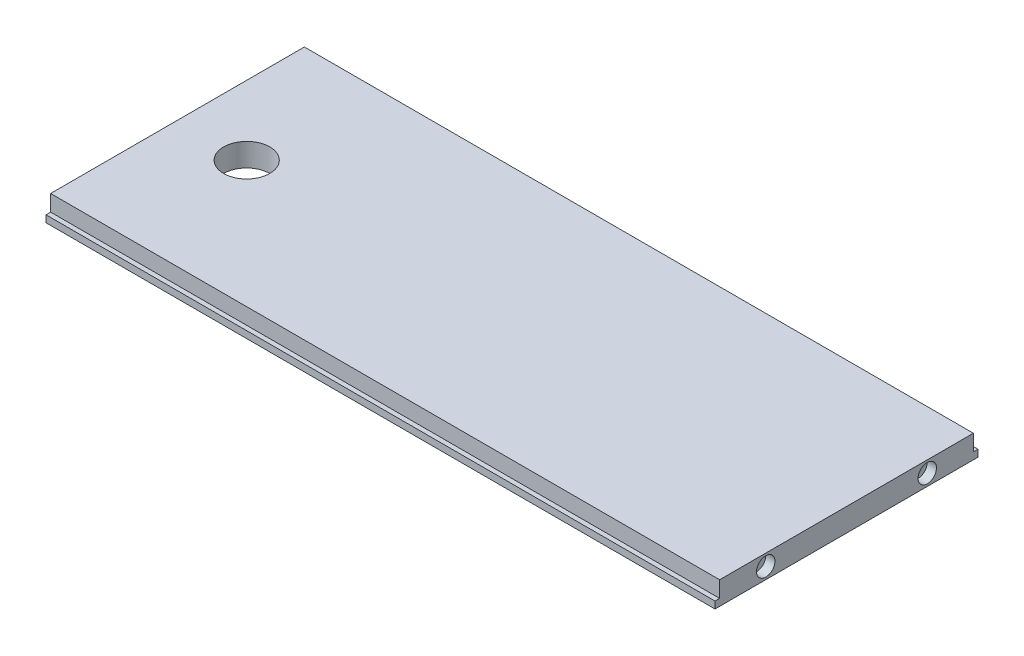
ISO-10303-21;
HEADER;
FILE_DESCRIPTION(('STEP AP214'),'2;1');
FILE_NAME('part.step','',(''),(''),'','','');
FILE_SCHEMA(('AUTOMOTIVE_DESIGN { 1 0 10303 214 1 1 1 1 }'));
ENDSEC;
DATA;
#1=APPLICATION_CONTEXT('core data for automotive mechanical design processes');
#2=APPLICATION_PROTOCOL_DEFINITION('international standard','automotive_design',2000,#1);
#3=PRODUCT_CONTEXT('',#1,'mechanical');
#4=PRODUCT('Part','Part','',(#3));
#5=PRODUCT_RELATED_PRODUCT_CATEGORY('part','',(#4));
#6=PRODUCT_DEFINITION_FORMATION('','',#4);
#7=PRODUCT_DEFINITION_CONTEXT('part definition',#1,'design');
#8=PRODUCT_DEFINITION('design','',#6,#7);
#9=PRODUCT_DEFINITION_SHAPE('','',#8);
#10=(LENGTH_UNIT() NAMED_UNIT(*) SI_UNIT(.MILLI.,.METRE.));
#11=(NAMED_UNIT(*) PLANE_ANGLE_UNIT() SI_UNIT($,.RADIAN.));
#12=(NAMED_UNIT(*) SI_UNIT($,.STERADIAN.) SOLID_ANGLE_UNIT());
#13=UNCERTAINTY_MEASURE_WITH_UNIT(LENGTH_MEASURE(1.E-05),#10,'distance_accuracy_value','');
#14=(GEOMETRIC_REPRESENTATION_CONTEXT(3) GLOBAL_UNCERTAINTY_ASSIGNED_CONTEXT((#13)) GLOBAL_UNIT_ASSIGNED_CONTEXT((#10,
#11,#12)) REPRESENTATION_CONTEXT('',''));
#15=CARTESIAN_POINT('',(0.,0.,0.));
#16=DIRECTION('',(0.,0.,1.));
#17=DIRECTION('',(1.,0.,0.));
#18=AXIS2_PLACEMENT_3D('',#15,#16,#17);
#19=CARTESIAN_POINT('',(0.,10.,-114.));
#20=DIRECTION('',(0.,0.,1.));
#21=DIRECTION('',(1.,0.,0.));
#22=AXIS2_PLACEMENT_3D('',#19,#20,#21);
#23=PLANE('',#22);
#24=DIRECTION('',(-1.,0.,0.));
#25=VECTOR('',#24,1.);
#26=CARTESIAN_POINT('',(0.,3.,-114.));
#27=LINE('',#26,#25);
#28=CARTESIAN_POINT('',(290.,3.,-114.));
#29=VERTEX_POINT('',#28);
#30=CARTESIAN_POINT('',(0.,3.,-114.));
#31=VERTEX_POINT('',#30);
#32=EDGE_CURVE('E109',#29,#31,#27,.T.);
#33=ORIENTED_EDGE('',*,*,#32,.F.);
#34=DIRECTION('',(0.,-1.,0.));
#35=VECTOR('',#34,1.);
#36=CARTESIAN_POINT('',(290.,10.,-114.));
#37=LINE('',#36,#35);
#38=CARTESIAN_POINT('',(290.,0.,-114.));
#39=VERTEX_POINT('',#38);
#40=EDGE_CURVE('E156',#29,#39,#37,.T.);
#41=ORIENTED_EDGE('',*,*,#40,.T.);
#42=DIRECTION('',(-1.,0.,0.));
#43=VECTOR('',#42,1.);
#44=CARTESIAN_POINT('',(0.,0.,-114.));
#45=LINE('',#44,#43);
#46=CARTESIAN_POINT('',(0.,0.,-114.));
#47=VERTEX_POINT('',#46);
#48=EDGE_CURVE('E141',#39,#47,#45,.T.);
#49=ORIENTED_EDGE('',*,*,#48,.T.);
#50=DIRECTION('',(0.,-1.,0.));
#51=VECTOR('',#50,1.);
#52=CARTESIAN_POINT('',(0.,10.,-114.));
#53=LINE('',#52,#51);
#54=EDGE_CURVE('E144',#31,#47,#53,.T.);
#55=ORIENTED_EDGE('',*,*,#54,.F.);
#56=EDGE_LOOP('',(#33,#41,#49,#55));
#57=FACE_BOUND('',#56,.T.);
#58=ADVANCED_FACE('F33',(#57),#23,.F.);
#59=CARTESIAN_POINT('',(0.,10.,0.));
#60=DIRECTION('',(1.,0.,0.));
#61=DIRECTION('',(0.,0.,-1.));
#62=AXIS2_PLACEMENT_3D('',#59,#60,#61);
#63=PLANE('',#62);
#64=DIRECTION('',(0.,0.,1.));
#65=VECTOR('',#64,1.);
#66=CARTESIAN_POINT('',(0.,10.,0.));
#67=LINE('',#66,#65);
#68=CARTESIAN_POINT('',(0.,10.,-112.));
#69=VERTEX_POINT('',#68);
#70=CARTESIAN_POINT('',(0.,10.,-2.));
#71=VERTEX_POINT('',#70);
#72=EDGE_CURVE('E117',#69,#71,#67,.T.);
#73=ORIENTED_EDGE('',*,*,#72,.F.);
#74=DIRECTION('',(0.,1.,0.));
#75=VECTOR('',#74,1.);
#76=CARTESIAN_POINT('',(0.,3.,-112.));
#77=LINE('',#76,#75);
#78=CARTESIAN_POINT('',(0.,3.,-112.));
#79=VERTEX_POINT('',#78);
#80=EDGE_CURVE('E56',#79,#69,#77,.T.);
#81=ORIENTED_EDGE('',*,*,#80,.F.);
#82=DIRECTION('',(0.,0.,1.));
#83=VECTOR('',#82,1.);
#84=CARTESIAN_POINT('',(0.,3.,-114.));
#85=LINE('',#84,#83);
#86=EDGE_CURVE('E104',#31,#79,#85,.T.);
#87=ORIENTED_EDGE('',*,*,#86,.F.);
#88=ORIENTED_EDGE('',*,*,#54,.T.);
#89=DIRECTION('',(0.,0.,1.));
#90=VECTOR('',#89,1.);
#91=CARTESIAN_POINT('',(0.,0.,0.));
#92=LINE('',#91,#90);
#93=CARTESIAN_POINT('',(0.,0.,0.));
#94=VERTEX_POINT('',#93);
#95=EDGE_CURVE('E119',#47,#94,#92,.T.);
#96=ORIENTED_EDGE('',*,*,#95,.T.);
#97=DIRECTION('',(0.,-1.,0.));
#98=VECTOR('',#97,1.);
#99=CARTESIAN_POINT('',(0.,10.,0.));
#100=LINE('',#99,#98);
#101=CARTESIAN_POINT('',(0.,3.,0.));
#102=VERTEX_POINT('',#101);
#103=EDGE_CURVE('E11',#102,#94,#100,.T.);
#104=ORIENTED_EDGE('',*,*,#103,.F.);
#105=DIRECTION('',(0.,0.,1.));
#106=VECTOR('',#105,1.);
#107=CARTESIAN_POINT('',(0.,3.,0.));
#108=LINE('',#107,#106);
#109=CARTESIAN_POINT('',(0.,3.,-2.));
#110=VERTEX_POINT('',#109);
#111=EDGE_CURVE('E124',#110,#102,#108,.T.);
#112=ORIENTED_EDGE('',*,*,#111,.F.);
#113=DIRECTION('',(0.,1.,0.));
#114=VECTOR('',#113,1.);
#115=CARTESIAN_POINT('',(0.,3.,-2.));
#116=LINE('',#115,#114);
#117=EDGE_CURVE('E136',#110,#71,#116,.T.);
#118=ORIENTED_EDGE('',*,*,#117,.T.);
#119=EDGE_LOOP('',(#73,#81,#87,#88,#96,#104,#112,#118));
#120=FACE_BOUND('',#119,.T.);
#121=ADVANCED_FACE('F35',(#120),#63,.F.);
#122=CARTESIAN_POINT('',(0.,10.,0.));
#123=DIRECTION('',(0.,0.,-1.));
#124=DIRECTION('',(-1.,0.,0.));
#125=AXIS2_PLACEMENT_3D('',#122,#123,#124);
#126=PLANE('',#125);
#127=DIRECTION('',(0.,-1.,0.));
#128=VECTOR('',#127,1.);
#129=CARTESIAN_POINT('',(290.,10.,0.));
#130=LINE('',#129,#128);
#131=CARTESIAN_POINT('',(290.,3.,0.));
#132=VERTEX_POINT('',#131);
#133=CARTESIAN_POINT('',(290.,0.,0.));
#134=VERTEX_POINT('',#133);
#135=EDGE_CURVE('E41',#132,#134,#130,.T.);
#136=ORIENTED_EDGE('',*,*,#135,.F.);
#137=DIRECTION('',(1.,0.,0.));
#138=VECTOR('',#137,1.);
#139=CARTESIAN_POINT('',(0.,3.,0.));
#140=LINE('',#139,#138);
#141=EDGE_CURVE('E126',#102,#132,#140,.T.);
#142=ORIENTED_EDGE('',*,*,#141,.F.);
#143=ORIENTED_EDGE('',*,*,#103,.T.);
#144=DIRECTION('',(1.,0.,0.));
#145=VECTOR('',#144,1.);
#146=CARTESIAN_POINT('',(0.,0.,0.));
#147=LINE('',#146,#145);
#148=EDGE_CURVE('E147',#94,#134,#147,.T.);
#149=ORIENTED_EDGE('',*,*,#148,.T.);
#150=EDGE_LOOP('',(#136,#142,#143,#149));
#151=FACE_BOUND('',#150,.T.);
#152=ADVANCED_FACE('F167',(#151),#126,.F.);
#153=CARTESIAN_POINT('',(290.,10.,0.));
#154=DIRECTION('',(-1.,0.,0.));
#155=DIRECTION('',(0.,0.,1.));
#156=AXIS2_PLACEMENT_3D('',#153,#154,#155);
#157=PLANE('',#156);
#158=CARTESIAN_POINT('',(290.,5.,-22.));
#159=DIRECTION('',(1.,0.,0.));
#160=DIRECTION('',(0.,0.,-1.));
#161=AXIS2_PLACEMENT_3D('',#158,#159,#160);
#162=CIRCLE('',#161,4.);
#163=CARTESIAN_POINT('',(290.,5.,-26.));
#164=VERTEX_POINT('',#163);
#165=EDGE_CURVE('E310',#164,#164,#162,.T.);
#166=ORIENTED_EDGE('',*,*,#165,.F.);
#167=EDGE_LOOP('',(#166));
#168=FACE_BOUND('',#167,.T.);
#169=CARTESIAN_POINT('',(290.,5.,-92.));
#170=DIRECTION('',(1.,0.,0.));
#171=DIRECTION('',(0.,0.,-1.));
#172=AXIS2_PLACEMENT_3D('',#169,#170,#171);
#173=CIRCLE('',#172,4.00000000000001);
#174=CARTESIAN_POINT('',(290.,5.,-96.));
#175=VERTEX_POINT('',#174);
#176=EDGE_CURVE('E305',#175,#175,#173,.T.);
#177=ORIENTED_EDGE('',*,*,#176,.F.);
#178=EDGE_LOOP('',(#177));
#179=FACE_BOUND('',#178,.T.);
#180=DIRECTION('',(0.,0.,-1.));
#181=VECTOR('',#180,1.);
#182=CARTESIAN_POINT('',(290.,3.,-114.));
#183=LINE('',#182,#181);
#184=CARTESIAN_POINT('',(290.,3.,-112.));
#185=VERTEX_POINT('',#184);
#186=EDGE_CURVE('E103',#185,#29,#183,.T.);
#187=ORIENTED_EDGE('',*,*,#186,.F.);
#188=DIRECTION('',(0.,1.,0.));
#189=VECTOR('',#188,1.);
#190=CARTESIAN_POINT('',(290.,3.,-112.));
#191=LINE('',#190,#189);
#192=CARTESIAN_POINT('',(290.,10.,-112.));
#193=VERTEX_POINT('',#192);
#194=EDGE_CURVE('E100',#185,#193,#191,.T.);
#195=ORIENTED_EDGE('',*,*,#194,.T.);
#196=DIRECTION('',(0.,0.,-1.));
#197=VECTOR('',#196,1.);
#198=CARTESIAN_POINT('',(290.,10.,0.));
#199=LINE('',#198,#197);
#200=CARTESIAN_POINT('',(290.,10.,-2.));
#201=VERTEX_POINT('',#200);
#202=EDGE_CURVE('E140',#201,#193,#199,.T.);
#203=ORIENTED_EDGE('',*,*,#202,.F.);
#204=DIRECTION('',(0.,1.,0.));
#205=VECTOR('',#204,1.);
#206=CARTESIAN_POINT('',(290.,3.,-2.));
#207=LINE('',#206,#205);
#208=CARTESIAN_POINT('',(290.,3.,-2.));
#209=VERTEX_POINT('',#208);
#210=EDGE_CURVE('E48',#209,#201,#207,.T.);
#211=ORIENTED_EDGE('',*,*,#210,.F.);
#212=DIRECTION('',(0.,0.,-1.));
#213=VECTOR('',#212,1.);
#214=CARTESIAN_POINT('',(290.,3.,0.));
#215=LINE('',#214,#213);
#216=EDGE_CURVE('E129',#132,#209,#215,.T.);
#217=ORIENTED_EDGE('',*,*,#216,.F.);
#218=ORIENTED_EDGE('',*,*,#135,.T.);
#219=DIRECTION('',(0.,0.,-1.));
#220=VECTOR('',#219,1.);
#221=CARTESIAN_POINT('',(290.,0.,0.));
#222=LINE('',#221,#220);
#223=EDGE_CURVE('E150',#134,#39,#222,.T.);
#224=ORIENTED_EDGE('',*,*,#223,.T.);
#225=ORIENTED_EDGE('',*,*,#40,.F.);
#226=EDGE_LOOP('',(#187,#195,#203,#211,#217,#218,#224,#225));
#227=FACE_BOUND('',#226,.T.);
#228=ADVANCED_FACE('F160',(#168,#179,#227),#157,.F.);
#229=CARTESIAN_POINT('',(0.,10.,0.));
#230=DIRECTION('',(0.,-1.,0.));
#231=DIRECTION('',(0.,0.,-1.));
#232=AXIS2_PLACEMENT_3D('',#229,#230,#231);
#233=PLANE('',#232);
#234=CARTESIAN_POINT('',(30.,10.,-57.));
#235=DIRECTION('',(0.,1.,0.));
#236=DIRECTION('',(0.,0.,1.));
#237=AXIS2_PLACEMENT_3D('',#234,#235,#236);
#238=CIRCLE('',#237,9.99999999999999);
#239=CARTESIAN_POINT('',(30.,10.,-47.));
#240=VERTEX_POINT('',#239);
#241=EDGE_CURVE('E303',#240,#240,#238,.T.);
#242=ORIENTED_EDGE('',*,*,#241,.F.);
#243=EDGE_LOOP('',(#242));
#244=FACE_BOUND('',#243,.T.);
#245=ORIENTED_EDGE('',*,*,#202,.T.);
#246=DIRECTION('',(1.,0.,0.));
#247=VECTOR('',#246,1.);
#248=CARTESIAN_POINT('',(0.,10.,-112.));
#249=LINE('',#248,#247);
#250=EDGE_CURVE('E112',#69,#193,#249,.T.);
#251=ORIENTED_EDGE('',*,*,#250,.F.);
#252=ORIENTED_EDGE('',*,*,#72,.T.);
#253=DIRECTION('',(-1.,0.,0.));
#254=VECTOR('',#253,1.);
#255=CARTESIAN_POINT('',(0.,10.,-2.));
#256=LINE('',#255,#254);
#257=EDGE_CURVE('E127',#201,#71,#256,.T.);
#258=ORIENTED_EDGE('',*,*,#257,.F.);
#259=EDGE_LOOP('',(#245,#251,#252,#258));
#260=FACE_BOUND('',#259,.T.);
#261=ADVANCED_FACE('F176',(#244,#260),#233,.F.);
#262=CARTESIAN_POINT('',(0.,0.,0.));
#263=DIRECTION('',(0.,-1.,0.));
#264=DIRECTION('',(0.,0.,-1.));
#265=AXIS2_PLACEMENT_3D('',#262,#263,#264);
#266=PLANE('',#265);
#267=CARTESIAN_POINT('',(30.,0.,-57.));
#268=DIRECTION('',(0.,1.,0.));
#269=DIRECTION('',(0.,0.,1.));
#270=AXIS2_PLACEMENT_3D('',#267,#268,#269);
#271=CIRCLE('',#270,9.99999999999999);
#272=CARTESIAN_POINT('',(30.,0.,-47.));
#273=VERTEX_POINT('',#272);
#274=EDGE_CURVE('E300',#273,#273,#271,.T.);
#275=ORIENTED_EDGE('',*,*,#274,.T.);
#276=EDGE_LOOP('',(#275));
#277=FACE_BOUND('',#276,.T.);
#278=ORIENTED_EDGE('',*,*,#95,.F.);
#279=ORIENTED_EDGE('',*,*,#48,.F.);
#280=ORIENTED_EDGE('',*,*,#223,.F.);
#281=ORIENTED_EDGE('',*,*,#148,.F.);
#282=EDGE_LOOP('',(#278,#279,#280,#281));
#283=FACE_BOUND('',#282,.T.);
#284=ADVANCED_FACE('F171',(#277,#283),#266,.T.);
#285=CARTESIAN_POINT('',(0.,3.,-2.));
#286=DIRECTION('',(0.,0.,-1.));
#287=DIRECTION('',(-1.,0.,0.));
#288=AXIS2_PLACEMENT_3D('',#285,#286,#287);
#289=PLANE('',#288);
#290=ORIENTED_EDGE('',*,*,#257,.T.);
#291=ORIENTED_EDGE('',*,*,#117,.F.);
#292=DIRECTION('',(-1.,0.,0.));
#293=VECTOR('',#292,1.);
#294=CARTESIAN_POINT('',(0.,3.,-2.));
#295=LINE('',#294,#293);
#296=EDGE_CURVE('E131',#209,#110,#295,.T.);
#297=ORIENTED_EDGE('',*,*,#296,.F.);
#298=ORIENTED_EDGE('',*,*,#210,.T.);
#299=EDGE_LOOP('',(#290,#291,#297,#298));
#300=FACE_BOUND('',#299,.T.);
#301=ADVANCED_FACE('F177',(#300),#289,.F.);
#302=CARTESIAN_POINT('',(0.,3.,0.));
#303=DIRECTION('',(0.,-1.,0.));
#304=DIRECTION('',(0.,0.,-1.));
#305=AXIS2_PLACEMENT_3D('',#302,#303,#304);
#306=PLANE('',#305);
#307=ORIENTED_EDGE('',*,*,#111,.T.);
#308=ORIENTED_EDGE('',*,*,#141,.T.);
#309=ORIENTED_EDGE('',*,*,#216,.T.);
#310=ORIENTED_EDGE('',*,*,#296,.T.);
#311=EDGE_LOOP('',(#307,#308,#309,#310));
#312=FACE_BOUND('',#311,.T.);
#313=ADVANCED_FACE('F180',(#312),#306,.F.);
#314=CARTESIAN_POINT('',(0.,3.,-112.));
#315=DIRECTION('',(0.,0.,1.));
#316=DIRECTION('',(1.,0.,0.));
#317=AXIS2_PLACEMENT_3D('',#314,#315,#316);
#318=PLANE('',#317);
#319=ORIENTED_EDGE('',*,*,#250,.T.);
#320=ORIENTED_EDGE('',*,*,#194,.F.);
#321=DIRECTION('',(1.,0.,0.));
#322=VECTOR('',#321,1.);
#323=CARTESIAN_POINT('',(0.,3.,-112.));
#324=LINE('',#323,#322);
#325=EDGE_CURVE('E96',#79,#185,#324,.T.);
#326=ORIENTED_EDGE('',*,*,#325,.F.);
#327=ORIENTED_EDGE('',*,*,#80,.T.);
#328=EDGE_LOOP('',(#319,#320,#326,#327));
#329=FACE_BOUND('',#328,.T.);
#330=ADVANCED_FACE('F98',(#329),#318,.F.);
#331=CARTESIAN_POINT('',(0.,3.,0.));
#332=DIRECTION('',(0.,1.,0.));
#333=DIRECTION('',(0.,0.,1.));
#334=AXIS2_PLACEMENT_3D('',#331,#332,#333);
#335=PLANE('',#334);
#336=ORIENTED_EDGE('',*,*,#86,.T.);
#337=ORIENTED_EDGE('',*,*,#325,.T.);
#338=ORIENTED_EDGE('',*,*,#186,.T.);
#339=ORIENTED_EDGE('',*,*,#32,.T.);
#340=EDGE_LOOP('',(#336,#337,#338,#339));
#341=FACE_BOUND('',#340,.T.);
#342=ADVANCED_FACE('F107',(#341),#335,.T.);
#343=CARTESIAN_POINT('',(286.,5.,-92.));
#344=DIRECTION('',(1.,0.,0.));
#345=DIRECTION('',(0.,0.,-1.));
#346=AXIS2_PLACEMENT_3D('',#343,#344,#345);
#347=CYLINDRICAL_SURFACE('',#346,4.00000000000001);
#348=CARTESIAN_POINT('',(286.,5.,-92.));
#349=DIRECTION('',(1.,0.,0.));
#350=DIRECTION('',(0.,0.,-1.));
#351=AXIS2_PLACEMENT_3D('',#348,#349,#350);
#352=CIRCLE('',#351,4.00000000000001);
#353=CARTESIAN_POINT('',(286.,5.,-96.));
#354=VERTEX_POINT('',#353);
#355=EDGE_CURVE('E313',#354,#354,#352,.T.);
#356=ORIENTED_EDGE('',*,*,#355,.F.);
#357=EDGE_LOOP('',(#356));
#358=FACE_BOUND('',#357,.T.);
#359=ORIENTED_EDGE('',*,*,#176,.T.);
#360=EDGE_LOOP('',(#359));
#361=FACE_BOUND('',#360,.T.);
#362=ADVANCED_FACE('F246',(#358,#361),#347,.F.);
#363=CARTESIAN_POINT('',(286.,5.,-92.));
#364=DIRECTION('',(1.,0.,0.));
#365=DIRECTION('',(0.,0.,-1.));
#366=AXIS2_PLACEMENT_3D('',#363,#364,#365);
#367=PLANE('',#366);
#368=ORIENTED_EDGE('',*,*,#355,.T.);
#369=EDGE_LOOP('',(#368));
#370=FACE_BOUND('',#369,.T.);
#371=ADVANCED_FACE('F255',(#370),#367,.T.);
#372=CARTESIAN_POINT('',(286.,5.,-22.));
#373=DIRECTION('',(1.,0.,0.));
#374=DIRECTION('',(0.,0.,-1.));
#375=AXIS2_PLACEMENT_3D('',#372,#373,#374);
#376=CYLINDRICAL_SURFACE('',#375,4.);
#377=CARTESIAN_POINT('',(286.,5.,-22.));
#378=DIRECTION('',(1.,0.,0.));
#379=DIRECTION('',(0.,0.,-1.));
#380=AXIS2_PLACEMENT_3D('',#377,#378,#379);
#381=CIRCLE('',#380,4.);
#382=CARTESIAN_POINT('',(286.,5.,-26.));
#383=VERTEX_POINT('',#382);
#384=EDGE_CURVE('E135',#383,#383,#381,.T.);
#385=ORIENTED_EDGE('',*,*,#384,.F.);
#386=EDGE_LOOP('',(#385));
#387=FACE_BOUND('',#386,.T.);
#388=ORIENTED_EDGE('',*,*,#165,.T.);
#389=EDGE_LOOP('',(#388));
#390=FACE_BOUND('',#389,.T.);
#391=ADVANCED_FACE('F262',(#387,#390),#376,.F.);
#392=CARTESIAN_POINT('',(286.,5.,-22.));
#393=DIRECTION('',(1.,0.,0.));
#394=DIRECTION('',(0.,0.,-1.));
#395=AXIS2_PLACEMENT_3D('',#392,#393,#394);
#396=PLANE('',#395);
#397=ORIENTED_EDGE('',*,*,#384,.T.);
#398=EDGE_LOOP('',(#397));
#399=FACE_BOUND('',#398,.T.);
#400=ADVANCED_FACE('F270',(#399),#396,.T.);
#401=CARTESIAN_POINT('',(30.,0.,-57.));
#402=DIRECTION('',(0.,1.,0.));
#403=DIRECTION('',(0.,0.,1.));
#404=AXIS2_PLACEMENT_3D('',#401,#402,#403);
#405=CYLINDRICAL_SURFACE('',#404,9.99999999999999);
#406=ORIENTED_EDGE('',*,*,#274,.F.);
#407=EDGE_LOOP('',(#406));
#408=FACE_BOUND('',#407,.T.);
#409=ORIENTED_EDGE('',*,*,#241,.T.);
#410=EDGE_LOOP('',(#409));
#411=FACE_BOUND('',#410,.T.);
#412=ADVANCED_FACE('F277',(#408,#411),#405,.F.);
#413=CLOSED_SHELL('',(#58,#121,#152,#228,#261,#284,#301,#313,#330,#342,#362,#371,#391,#400,#412));
#414=MANIFOLD_SOLID_BREP('B2',#413);
#415=ADVANCED_BREP_SHAPE_REPRESENTATION('',(#18,#414),#14);
#416=SHAPE_DEFINITION_REPRESENTATION(#9,#415);
ENDSEC;
END-ISO-10303-21;
